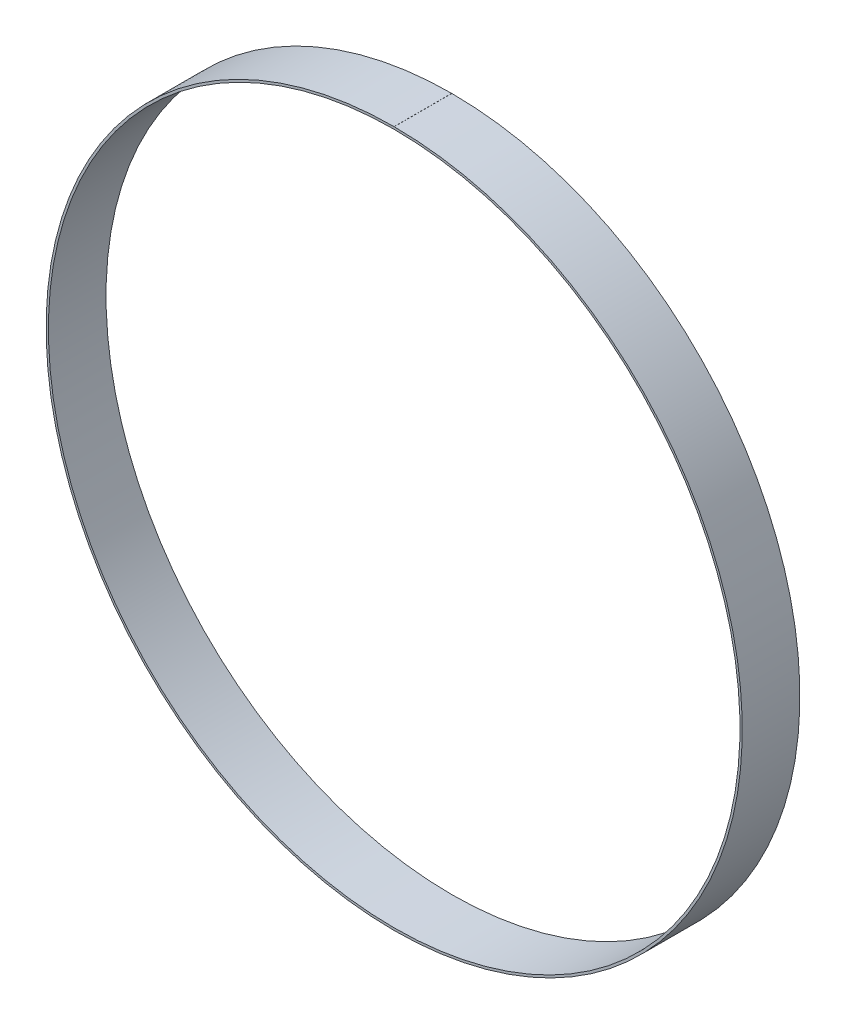
ISO-10303-21;
HEADER;
FILE_DESCRIPTION(('STEP AP214'),'2;1');
FILE_NAME('part.step','',(''),(''),'','','');
FILE_SCHEMA(('AUTOMOTIVE_DESIGN { 1 0 10303 214 1 1 1 1 }'));
ENDSEC;
DATA;
#1=APPLICATION_CONTEXT('core data for automotive mechanical design processes');
#2=APPLICATION_PROTOCOL_DEFINITION('international standard','automotive_design',2000,#1);
#3=PRODUCT_CONTEXT('',#1,'mechanical');
#4=PRODUCT('Part','Part','',(#3));
#5=PRODUCT_RELATED_PRODUCT_CATEGORY('part','',(#4));
#6=PRODUCT_DEFINITION_FORMATION('','',#4);
#7=PRODUCT_DEFINITION_CONTEXT('part definition',#1,'design');
#8=PRODUCT_DEFINITION('design','',#6,#7);
#9=PRODUCT_DEFINITION_SHAPE('','',#8);
#10=(LENGTH_UNIT() NAMED_UNIT(*) SI_UNIT(.MILLI.,.METRE.));
#11=(NAMED_UNIT(*) PLANE_ANGLE_UNIT() SI_UNIT($,.RADIAN.));
#12=(NAMED_UNIT(*) SI_UNIT($,.STERADIAN.) SOLID_ANGLE_UNIT());
#13=UNCERTAINTY_MEASURE_WITH_UNIT(LENGTH_MEASURE(1.E-05),#10,'distance_accuracy_value','');
#14=(GEOMETRIC_REPRESENTATION_CONTEXT(3) GLOBAL_UNCERTAINTY_ASSIGNED_CONTEXT((#13)) GLOBAL_UNIT_ASSIGNED_CONTEXT((#10,
#11,#12)) REPRESENTATION_CONTEXT('',''));
#15=CARTESIAN_POINT('',(0.,0.,0.));
#16=DIRECTION('',(0.,0.,1.));
#17=DIRECTION('',(1.,0.,0.));
#18=AXIS2_PLACEMENT_3D('',#15,#16,#17);
#19=CARTESIAN_POINT('',(-0.0996688741721856,300.99998349853,25.));
#20=DIRECTION('',(-0.999999945177842,-0.000331125827814853,0.));
#21=DIRECTION('',(0.,0.,1.));
#22=AXIS2_PLACEMENT_3D('',#19,#20,#21);
#23=PLANE('',#22);
#24=DIRECTION('',(-0.000331125827814853,0.999999945177842,0.));
#25=VECTOR('',#24,1.);
#26=CARTESIAN_POINT('',(-0.0996688741721856,300.99998349853,50.));
#27=LINE('',#26,#25);
#28=CARTESIAN_POINT('',(-0.0993377483443858,299.999983553352,50.));
#29=VERTEX_POINT('',#28);
#30=CARTESIAN_POINT('',(-0.100000000000016,301.999983443708,50.));
#31=VERTEX_POINT('',#30);
#32=EDGE_CURVE('E11',#29,#31,#27,.T.);
#33=ORIENTED_EDGE('',*,*,#32,.F.);
#34=DIRECTION('',(0.,0.,-1.));
#35=VECTOR('',#34,1.);
#36=CARTESIAN_POINT('',(-0.0993377483443858,299.999983553352,1941.8023516371));
#37=LINE('',#36,#35);
#38=CARTESIAN_POINT('',(-0.0993377483444524,299.999983553352,0.));
#39=VERTEX_POINT('',#38);
#40=EDGE_CURVE('E90',#39,#29,#37,.F.);
#41=ORIENTED_EDGE('',*,*,#40,.F.);
#42=DIRECTION('',(-0.000331125827815125,0.999999945177842,0.));
#43=VECTOR('',#42,1.);
#44=CARTESIAN_POINT('',(-0.0996688741722676,300.99998349853,0.));
#45=LINE('',#44,#43);
#46=CARTESIAN_POINT('',(-0.100000000000083,301.999983443708,0.));
#47=VERTEX_POINT('',#46);
#48=EDGE_CURVE('E52',#39,#47,#45,.T.);
#49=ORIENTED_EDGE('',*,*,#48,.T.);
#50=DIRECTION('',(0.,0.,-1.));
#51=VECTOR('',#50,1.);
#52=CARTESIAN_POINT('',(-0.100000000000016,301.999983443708,1941.8023516371));
#53=LINE('',#52,#51);
#54=EDGE_CURVE('E89',#47,#31,#53,.F.);
#55=ORIENTED_EDGE('',*,*,#54,.T.);
#56=EDGE_LOOP('',(#33,#41,#49,#55));
#57=FACE_BOUND('',#56,.T.);
#58=ADVANCED_FACE('F42',(#57),#23,.F.);
#59=CARTESIAN_POINT('',(0.,0.,0.));
#60=DIRECTION('',(0.,0.,1.));
#61=DIRECTION('',(1.,0.,0.));
#62=AXIS2_PLACEMENT_3D('',#59,#60,#61);
#63=PLANE('',#62);
#64=ORIENTED_EDGE('',*,*,#48,.F.);
#65=CARTESIAN_POINT('',(0.,0.,0.));
#66=DIRECTION('',(0.,0.,-1.));
#67=DIRECTION('',(-1.,0.,0.));
#68=AXIS2_PLACEMENT_3D('',#65,#66,#67);
#69=CIRCLE('',#68,300.);
#70=CARTESIAN_POINT('',(-3.93003561504335E-12,300.,0.));
#71=VERTEX_POINT('',#70);
#72=EDGE_CURVE('E110',#71,#39,#69,.T.);
#73=ORIENTED_EDGE('',*,*,#72,.F.);
#74=DIRECTION('',(0.,1.,0.));
#75=VECTOR('',#74,1.);
#76=CARTESIAN_POINT('',(-3.94341952367881E-12,301.,0.));
#77=LINE('',#76,#75);
#78=CARTESIAN_POINT('',(-3.95680343231427E-12,302.,0.));
#79=VERTEX_POINT('',#78);
#80=EDGE_CURVE('E85',#71,#79,#77,.T.);
#81=ORIENTED_EDGE('',*,*,#80,.T.);
#82=CARTESIAN_POINT('',(0.,0.,0.));
#83=DIRECTION('',(0.,0.,-1.));
#84=DIRECTION('',(-1.,0.,0.));
#85=AXIS2_PLACEMENT_3D('',#82,#83,#84);
#86=CIRCLE('',#85,302.);
#87=EDGE_CURVE('E97',#79,#47,#86,.T.);
#88=ORIENTED_EDGE('',*,*,#87,.T.);
#89=EDGE_LOOP('',(#64,#73,#81,#88));
#90=FACE_BOUND('',#89,.T.);
#91=ADVANCED_FACE('F100',(#90),#63,.F.);
#92=CARTESIAN_POINT('',(-3.93650769533321E-12,301.,25.));
#93=DIRECTION('',(1.,0.,0.));
#94=DIRECTION('',(0.,0.,-1.));
#95=AXIS2_PLACEMENT_3D('',#92,#93,#94);
#96=PLANE('',#95);
#97=ORIENTED_EDGE('',*,*,#80,.F.);
#98=DIRECTION('',(0.,0.,-1.));
#99=VECTOR('',#98,1.);
#100=CARTESIAN_POINT('',(-3.93003561504335E-12,300.,1941.8023516371));
#101=LINE('',#100,#99);
#102=CARTESIAN_POINT('',(-3.86342223356584E-12,300.,50.));
#103=VERTEX_POINT('',#102);
#104=EDGE_CURVE('E101',#103,#71,#101,.T.);
#105=ORIENTED_EDGE('',*,*,#104,.F.);
#106=DIRECTION('',(0.,1.,0.));
#107=VECTOR('',#106,1.);
#108=CARTESIAN_POINT('',(-3.90655765502447E-12,301.,50.));
#109=LINE('',#108,#107);
#110=CARTESIAN_POINT('',(-3.88974596162691E-12,302.,50.));
#111=VERTEX_POINT('',#110);
#112=EDGE_CURVE('E46',#103,#111,#109,.T.);
#113=ORIENTED_EDGE('',*,*,#112,.T.);
#114=DIRECTION('',(0.,0.,-1.));
#115=VECTOR('',#114,1.);
#116=CARTESIAN_POINT('',(-3.95680343231427E-12,302.,1941.8023516371));
#117=LINE('',#116,#115);
#118=EDGE_CURVE('E107',#111,#79,#117,.T.);
#119=ORIENTED_EDGE('',*,*,#118,.T.);
#120=EDGE_LOOP('',(#97,#105,#113,#119));
#121=FACE_BOUND('',#120,.T.);
#122=ADVANCED_FACE('F114',(#121),#96,.F.);
#123=CARTESIAN_POINT('',(0.,0.,50.));
#124=DIRECTION('',(0.,0.,-1.));
#125=DIRECTION('',(-1.,0.,0.));
#126=AXIS2_PLACEMENT_3D('',#123,#124,#125);
#127=PLANE('',#126);
#128=CARTESIAN_POINT('',(0.,0.,50.));
#129=DIRECTION('',(0.,0.,-1.));
#130=DIRECTION('',(-1.,0.,0.));
#131=AXIS2_PLACEMENT_3D('',#128,#129,#130);
#132=CIRCLE('',#131,300.);
#133=EDGE_CURVE('E104',#29,#103,#132,.F.);
#134=ORIENTED_EDGE('',*,*,#133,.F.);
#135=ORIENTED_EDGE('',*,*,#32,.T.);
#136=CARTESIAN_POINT('',(0.,0.,50.));
#137=DIRECTION('',(0.,0.,-1.));
#138=DIRECTION('',(-1.,0.,0.));
#139=AXIS2_PLACEMENT_3D('',#136,#137,#138);
#140=CIRCLE('',#139,302.);
#141=EDGE_CURVE('E98',#31,#111,#140,.F.);
#142=ORIENTED_EDGE('',*,*,#141,.T.);
#143=ORIENTED_EDGE('',*,*,#112,.F.);
#144=EDGE_LOOP('',(#134,#135,#142,#143));
#145=FACE_BOUND('',#144,.T.);
#146=ADVANCED_FACE('F44',(#145),#127,.F.);
#147=CARTESIAN_POINT('',(0.,0.,1941.8023516371));
#148=DIRECTION('',(0.,0.,-1.));
#149=DIRECTION('',(-1.,0.,0.));
#150=AXIS2_PLACEMENT_3D('',#147,#148,#149);
#151=CYLINDRICAL_SURFACE('',#150,302.);
#152=ORIENTED_EDGE('',*,*,#118,.F.);
#153=ORIENTED_EDGE('',*,*,#141,.F.);
#154=ORIENTED_EDGE('',*,*,#54,.F.);
#155=ORIENTED_EDGE('',*,*,#87,.F.);
#156=EDGE_LOOP('',(#152,#153,#154,#155));
#157=FACE_BOUND('',#156,.T.);
#158=ADVANCED_FACE('F96',(#157),#151,.T.);
#159=CARTESIAN_POINT('',(0.,0.,1941.8023516371));
#160=DIRECTION('',(0.,0.,-1.));
#161=DIRECTION('',(-1.,0.,0.));
#162=AXIS2_PLACEMENT_3D('',#159,#160,#161);
#163=CYLINDRICAL_SURFACE('',#162,300.);
#164=ORIENTED_EDGE('',*,*,#104,.T.);
#165=ORIENTED_EDGE('',*,*,#72,.T.);
#166=ORIENTED_EDGE('',*,*,#40,.T.);
#167=ORIENTED_EDGE('',*,*,#133,.T.);
#168=EDGE_LOOP('',(#164,#165,#166,#167));
#169=FACE_BOUND('',#168,.T.);
#170=ADVANCED_FACE('F116',(#169),#163,.F.);
#171=CLOSED_SHELL('',(#58,#91,#122,#146,#158,#170));
#172=MANIFOLD_SOLID_BREP('B2',#171);
#173=ADVANCED_BREP_SHAPE_REPRESENTATION('',(#18,#172),#14);
#174=SHAPE_DEFINITION_REPRESENTATION(#9,#173);
ENDSEC;
END-ISO-10303-21;
